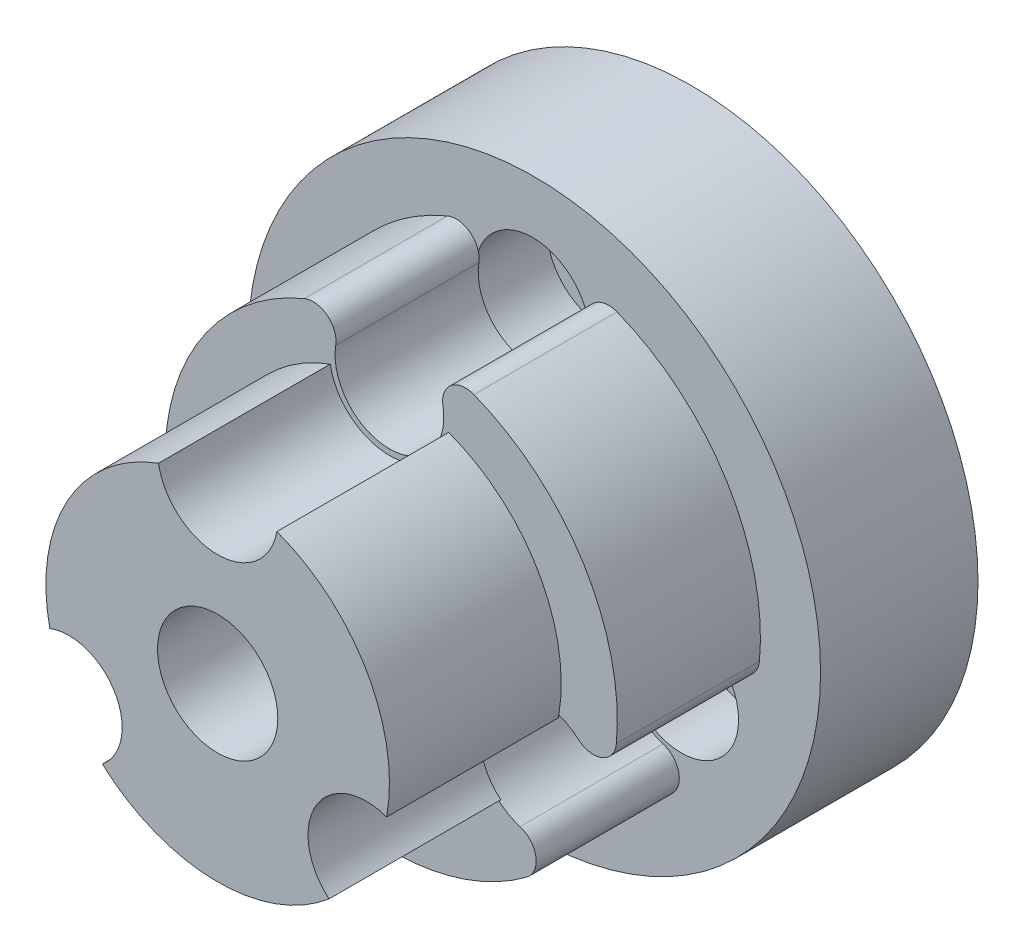
ISO-10303-21;
HEADER;
FILE_DESCRIPTION(('STEP AP214'),'2;1');
FILE_NAME('part.step','',(''),(''),'','','');
FILE_SCHEMA(('AUTOMOTIVE_DESIGN { 1 0 10303 214 1 1 1 1 }'));
ENDSEC;
DATA;
#1=APPLICATION_CONTEXT('core data for automotive mechanical design processes');
#2=APPLICATION_PROTOCOL_DEFINITION('international standard','automotive_design',2000,#1);
#3=PRODUCT_CONTEXT('',#1,'mechanical');
#4=PRODUCT('Part','Part','',(#3));
#5=PRODUCT_RELATED_PRODUCT_CATEGORY('part','',(#4));
#6=PRODUCT_DEFINITION_FORMATION('','',#4);
#7=PRODUCT_DEFINITION_CONTEXT('part definition',#1,'design');
#8=PRODUCT_DEFINITION('design','',#6,#7);
#9=PRODUCT_DEFINITION_SHAPE('','',#8);
#10=(LENGTH_UNIT() NAMED_UNIT(*) SI_UNIT(.MILLI.,.METRE.));
#11=(NAMED_UNIT(*) PLANE_ANGLE_UNIT() SI_UNIT($,.RADIAN.));
#12=(NAMED_UNIT(*) SI_UNIT($,.STERADIAN.) SOLID_ANGLE_UNIT());
#13=UNCERTAINTY_MEASURE_WITH_UNIT(LENGTH_MEASURE(1.E-05),#10,'distance_accuracy_value','');
#14=(GEOMETRIC_REPRESENTATION_CONTEXT(3) GLOBAL_UNCERTAINTY_ASSIGNED_CONTEXT((#13)) GLOBAL_UNIT_ASSIGNED_CONTEXT((#10,
#11,#12)) REPRESENTATION_CONTEXT('',''));
#15=CARTESIAN_POINT('',(0.,0.,0.));
#16=DIRECTION('',(0.,0.,1.));
#17=DIRECTION('',(1.,0.,0.));
#18=AXIS2_PLACEMENT_3D('',#15,#16,#17);
#19=CARTESIAN_POINT('',(-2.62756297658903,-1.43343334970842,-85.691169136308));
#20=DIRECTION('',(0.,0.,1.));
#21=DIRECTION('',(1.,0.,0.));
#22=AXIS2_PLACEMENT_3D('',#19,#20,#21);
#23=PLANE('',#22);
#24=CARTESIAN_POINT('',(-0.0589735304714241,0.133133300583156,-85.691169136308));
#25=DIRECTION('',(0.,0.,1.));
#26=DIRECTION('',(1.,0.,0.));
#27=AXIS2_PLACEMENT_3D('',#24,#25,#26);
#28=CIRCLE('',#27,6.);
#29=CARTESIAN_POINT('',(-2.12632985052675,5.76572043669808,-85.691169136308));
#30=VERTEX_POINT('',#29);
#31=CARTESIAN_POINT('',(-5.94622995595187,-1.02454186138551,-85.691169136308));
#32=VERTEX_POINT('',#31);
#33=EDGE_CURVE('E55',#30,#32,#28,.T.);
#34=ORIENTED_EDGE('',*,*,#33,.F.);
#35=CARTESIAN_POINT('',(-0.0589735304714241,6.13313330058316,-85.691169136308));
#36=DIRECTION('',(0.,0.,-1.));
#37=DIRECTION('',(1.,0.,0.));
#38=AXIS2_PLACEMENT_3D('',#35,#36,#37);
#39=CIRCLE('',#38,2.09975102491246);
#40=CARTESIAN_POINT('',(2.0083827895839,5.76572043669808,-85.691169136308));
#41=VERTEX_POINT('',#40);
#42=EDGE_CURVE('E59',#41,#30,#39,.T.);
#43=ORIENTED_EDGE('',*,*,#42,.F.);
#44=CARTESIAN_POINT('',(-0.0589735304714241,0.133133300583156,-85.691169136308));
#45=DIRECTION('',(0.,0.,1.));
#46=DIRECTION('',(1.,0.,0.));
#47=AXIS2_PLACEMENT_3D('',#44,#45,#46);
#48=CIRCLE('',#47,6.);
#49=CARTESIAN_POINT('',(5.85967243142608,-0.851564611324014,-85.691169136308));
#50=VERTEX_POINT('',#49);
#51=EDGE_CURVE('E11',#50,#41,#48,.T.);
#52=ORIENTED_EDGE('',*,*,#51,.F.);
#53=CARTESIAN_POINT('',(5.13717889223521,-2.86686669941684,-85.691169136308));
#54=DIRECTION('',(0.,0.,-1.));
#55=DIRECTION('',(1.,0.,0.));
#56=AXIS2_PLACEMENT_3D('',#53,#54,#55);
#57=CIRCLE('',#56,2.14089687291188);
#58=CARTESIAN_POINT('',(6.54432672808659,-1.25336913558149,-85.691169136308));
#59=VERTEX_POINT('',#58);
#60=EDGE_CURVE('E240',#50,#59,#57,.T.);
#61=ORIENTED_EDGE('',*,*,#60,.T.);
#62=CARTESIAN_POINT('',(7.07014293293255,-0.650445161334821,-85.691169136308));
#63=DIRECTION('',(0.,0.,1.));
#64=DIRECTION('',(1.,0.,0.));
#65=AXIS2_PLACEMENT_3D('',#62,#63,#64);
#66=CIRCLE('',#65,0.8);
#67=CARTESIAN_POINT('',(7.86677875636157,-0.723734756978181,-85.691169136308));
#68=VERTEX_POINT('',#67);
#69=EDGE_CURVE('E327',#59,#68,#66,.T.);
#70=ORIENTED_EDGE('',*,*,#69,.T.);
#71=CARTESIAN_POINT('',(0.,0.,-85.691169136308));
#72=DIRECTION('',(0.,0.,1.));
#73=DIRECTION('',(1.,0.,0.));
#74=AXIS2_PLACEMENT_3D('',#71,#72,#73);
#75=CIRCLE('',#74,7.9);
#76=CARTESIAN_POINT('',(2.89142422364797,7.35184779214734,-85.691169136308));
#77=VERTEX_POINT('',#76);
#78=EDGE_CURVE('E243',#68,#77,#75,.T.);
#79=ORIENTED_EDGE('',*,*,#78,.T.);
#80=CARTESIAN_POINT('',(2.59862177062033,6.60735687648685,-85.691169136308));
#81=DIRECTION('',(0.,0.,1.));
#82=DIRECTION('',(1.,0.,0.));
#83=AXIS2_PLACEMENT_3D('',#80,#81,#82);
#84=CIRCLE('',#83,0.8);
#85=CARTESIAN_POINT('',(1.81106192058844,6.46682402403679,-85.691169136308));
#86=VERTEX_POINT('',#85);
#87=EDGE_CURVE('E333',#77,#86,#84,.T.);
#88=ORIENTED_EDGE('',*,*,#87,.T.);
#89=CARTESIAN_POINT('',(-0.0589735304714284,6.13313330058316,-85.691169136308));
#90=DIRECTION('',(0.,0.,-1.));
#91=DIRECTION('',(1.,0.,0.));
#92=AXIS2_PLACEMENT_3D('',#89,#90,#91);
#93=CIRCLE('',#92,1.89957418574261);
#94=CARTESIAN_POINT('',(-1.9350798652424,6.43080276117985,-85.691169136308));
#95=VERTEX_POINT('',#94);
#96=EDGE_CURVE('E247',#86,#95,#93,.T.);
#97=ORIENTED_EDGE('',*,*,#96,.T.);
#98=CARTESIAN_POINT('',(-2.72519644983372,6.55616536626508,-85.691169136308));
#99=DIRECTION('',(0.,0.,1.));
#100=DIRECTION('',(1.,0.,0.));
#101=AXIS2_PLACEMENT_3D('',#98,#99,#100);
#102=CIRCLE('',#101,0.8);
#103=CARTESIAN_POINT('',(-3.03226083854737,7.29488822443579,-85.691169136308));
#104=VERTEX_POINT('',#103);
#105=EDGE_CURVE('E331',#95,#104,#102,.T.);
#106=ORIENTED_EDGE('',*,*,#105,.T.);
#107=CARTESIAN_POINT('',(0.,0.,-85.691169136308));
#108=DIRECTION('',(0.,0.,1.));
#109=DIRECTION('',(1.,0.,0.));
#110=AXIS2_PLACEMENT_3D('',#107,#108,#109);
#111=CIRCLE('',#110,7.9);
#112=CARTESIAN_POINT('',(-7.85373274021811,-0.853745890312869,-85.691169136308));
#113=VERTEX_POINT('',#112);
#114=EDGE_CURVE('E229',#104,#113,#111,.T.);
#115=ORIENTED_EDGE('',*,*,#114,.T.);
#116=CARTESIAN_POINT('',(-7.05841803234792,-0.767290610281186,-85.691169136308));
#117=DIRECTION('',(0.,0.,1.));
#118=DIRECTION('',(1.,0.,0.));
#119=AXIS2_PLACEMENT_3D('',#116,#117,#118);
#120=CIRCLE('',#119,0.8);
#121=CARTESIAN_POINT('',(-6.5371760947082,-1.37417350050432,-85.691169136308));
#122=VERTEX_POINT('',#121);
#123=EDGE_CURVE('E335',#113,#122,#120,.T.);
#124=ORIENTED_EDGE('',*,*,#123,.T.);
#125=CARTESIAN_POINT('',(-5.25512595317806,-2.86686669941684,-85.691169136308));
#126=DIRECTION('',(0.,0.,-1.));
#127=DIRECTION('',(1.,0.,0.));
#128=AXIS2_PLACEMENT_3D('',#125,#126,#127);
#129=CIRCLE('',#128,1.96768532836863);
#130=EDGE_CURVE('E234',#122,#32,#129,.T.);
#131=ORIENTED_EDGE('',*,*,#130,.T.);
#132=EDGE_LOOP('',(#34,#43,#52,#61,#70,#79,#88,#97,#106,#115,#124,#131));
#133=FACE_BOUND('',#132,.T.);
#134=ADVANCED_FACE('F37',(#133),#23,.T.);
#135=CARTESIAN_POINT('',(0.,0.,-85.691169136308));
#136=DIRECTION('',(0.,0.,1.));
#137=DIRECTION('',(1.,0.,0.));
#138=AXIS2_PLACEMENT_3D('',#135,#136,#137);
#139=CIRCLE('',#138,2.1);
#140=CARTESIAN_POINT('',(1.8894152834878,0.91657508504363,-85.691169136308));
#141=VERTEX_POINT('',#140);
#142=CARTESIAN_POINT('',(-1.94838881395916,-0.783441784460611,-85.691169136308));
#143=VERTEX_POINT('',#142);
#144=EDGE_CURVE('E221',#141,#143,#139,.T.);
#145=ORIENTED_EDGE('',*,*,#144,.F.);
#146=CARTESIAN_POINT('',(-0.0589735304714241,0.133133300583156,-85.691169136308));
#147=DIRECTION('',(0.,0.,1.));
#148=DIRECTION('',(1.,0.,0.));
#149=AXIS2_PLACEMENT_3D('',#146,#147,#148);
#150=CIRCLE('',#149,2.10000000000001);
#151=EDGE_CURVE('E401',#141,#143,#150,.T.);
#152=ORIENTED_EDGE('',*,*,#151,.T.);
#153=EDGE_LOOP('',(#145,#152));
#154=FACE_BOUND('',#153,.T.);
#155=ADVANCED_FACE('F425',(#154),#23,.T.);
#156=CARTESIAN_POINT('',(0.,0.,-93.191169136308));
#157=DIRECTION('',(0.,0.,1.));
#158=DIRECTION('',(1.,0.,0.));
#159=AXIS2_PLACEMENT_3D('',#156,#157,#158);
#160=PLANE('',#159);
#161=CARTESIAN_POINT('',(-5.25512595317806,-2.86686669941684,-93.191169136308));
#162=DIRECTION('',(0.,0.,1.));
#163=DIRECTION('',(1.,0.,0.));
#164=AXIS2_PLACEMENT_3D('',#161,#162,#163);
#165=CIRCLE('',#164,1.20000000000005);
#166=CARTESIAN_POINT('',(-4.05512595317801,-2.86686669941684,-93.191169136308));
#167=VERTEX_POINT('',#166);
#168=EDGE_CURVE('E290',#167,#167,#165,.T.);
#169=ORIENTED_EDGE('',*,*,#168,.F.);
#170=EDGE_LOOP('',(#169));
#171=FACE_BOUND('',#170,.T.);
#172=CARTESIAN_POINT('',(-5.25512595317806,-2.86686669941684,-93.191169136308));
#173=DIRECTION('',(0.,0.,1.));
#174=DIRECTION('',(1.,0.,0.));
#175=AXIS2_PLACEMENT_3D('',#172,#173,#174);
#176=CIRCLE('',#175,2.);
#177=CARTESIAN_POINT('',(-3.25512595317806,-2.86686669941684,-93.191169136308));
#178=VERTEX_POINT('',#177);
#179=EDGE_CURVE('E277',#178,#178,#176,.T.);
#180=ORIENTED_EDGE('',*,*,#179,.T.);
#181=EDGE_LOOP('',(#180));
#182=FACE_BOUND('',#181,.T.);
#183=ADVANCED_FACE('F431',(#171,#182),#160,.T.);
#184=CARTESIAN_POINT('',(-0.0589735304714284,6.13313330058316,-93.191169136308));
#185=DIRECTION('',(0.,0.,1.));
#186=DIRECTION('',(1.,0.,0.));
#187=AXIS2_PLACEMENT_3D('',#184,#185,#186);
#188=CIRCLE('',#187,1.2);
#189=CARTESIAN_POINT('',(1.14102646952857,6.13313330058316,-93.191169136308));
#190=VERTEX_POINT('',#189);
#191=EDGE_CURVE('E302',#190,#190,#188,.T.);
#192=ORIENTED_EDGE('',*,*,#191,.F.);
#193=EDGE_LOOP('',(#192));
#194=FACE_BOUND('',#193,.T.);
#195=CARTESIAN_POINT('',(-0.0589735304714284,6.13313330058316,-93.191169136308));
#196=DIRECTION('',(0.,0.,1.));
#197=DIRECTION('',(1.,0.,0.));
#198=AXIS2_PLACEMENT_3D('',#195,#196,#197);
#199=CIRCLE('',#198,2.);
#200=CARTESIAN_POINT('',(1.94102646952857,6.13313330058316,-93.191169136308));
#201=VERTEX_POINT('',#200);
#202=EDGE_CURVE('E272',#201,#201,#199,.T.);
#203=ORIENTED_EDGE('',*,*,#202,.T.);
#204=EDGE_LOOP('',(#203));
#205=FACE_BOUND('',#204,.T.);
#206=ADVANCED_FACE('F558',(#194,#205),#160,.T.);
#207=CARTESIAN_POINT('',(5.13717889223521,-2.86686669941684,-93.191169136308));
#208=DIRECTION('',(0.,0.,1.));
#209=DIRECTION('',(1.,0.,0.));
#210=AXIS2_PLACEMENT_3D('',#207,#208,#209);
#211=CIRCLE('',#210,1.20000000000005);
#212=CARTESIAN_POINT('',(6.33717889223526,-2.86686669941684,-93.191169136308));
#213=VERTEX_POINT('',#212);
#214=EDGE_CURVE('E296',#213,#213,#211,.T.);
#215=ORIENTED_EDGE('',*,*,#214,.F.);
#216=EDGE_LOOP('',(#215));
#217=FACE_BOUND('',#216,.T.);
#218=CARTESIAN_POINT('',(5.13717889223521,-2.86686669941684,-93.191169136308));
#219=DIRECTION('',(0.,0.,1.));
#220=DIRECTION('',(1.,0.,0.));
#221=AXIS2_PLACEMENT_3D('',#218,#219,#220);
#222=CIRCLE('',#221,2.);
#223=CARTESIAN_POINT('',(7.13717889223521,-2.86686669941684,-93.191169136308));
#224=VERTEX_POINT('',#223);
#225=EDGE_CURVE('E250',#224,#224,#222,.T.);
#226=ORIENTED_EDGE('',*,*,#225,.T.);
#227=EDGE_LOOP('',(#226));
#228=FACE_BOUND('',#227,.T.);
#229=ADVANCED_FACE('F554',(#217,#228),#160,.T.);
#230=CARTESIAN_POINT('',(0.,0.,-96.191169136308));
#231=DIRECTION('',(0.,0.,1.));
#232=DIRECTION('',(1.,0.,0.));
#233=AXIS2_PLACEMENT_3D('',#230,#231,#232);
#234=PLANE('',#233);
#235=CARTESIAN_POINT('',(0.,0.,-96.191169136308));
#236=DIRECTION('',(0.,0.,1.));
#237=DIRECTION('',(1.,0.,0.));
#238=AXIS2_PLACEMENT_3D('',#235,#236,#237);
#239=CIRCLE('',#238,10.);
#240=CARTESIAN_POINT('',(10.,0.,-96.191169136308));
#241=VERTEX_POINT('',#240);
#242=EDGE_CURVE('E261',#241,#241,#239,.T.);
#243=ORIENTED_EDGE('',*,*,#242,.F.);
#244=EDGE_LOOP('',(#243));
#245=FACE_BOUND('',#244,.T.);
#246=CARTESIAN_POINT('',(0.,0.,-96.191169136308));
#247=DIRECTION('',(0.,0.,1.));
#248=DIRECTION('',(1.,0.,0.));
#249=AXIS2_PLACEMENT_3D('',#246,#247,#248);
#250=CIRCLE('',#249,2.1);
#251=CARTESIAN_POINT('',(2.10000000000001,0.,-96.191169136308));
#252=VERTEX_POINT('',#251);
#253=EDGE_CURVE('E305',#252,#252,#250,.T.);
#254=ORIENTED_EDGE('',*,*,#253,.T.);
#255=EDGE_LOOP('',(#254));
#256=FACE_BOUND('',#255,.T.);
#257=CARTESIAN_POINT('',(-0.0589735304714284,6.13313330058316,-96.191169136308));
#258=DIRECTION('',(0.,0.,1.));
#259=DIRECTION('',(1.,0.,0.));
#260=AXIS2_PLACEMENT_3D('',#257,#258,#259);
#261=CIRCLE('',#260,1.2);
#262=CARTESIAN_POINT('',(1.14102646952857,6.13313330058316,-96.191169136308));
#263=VERTEX_POINT('',#262);
#264=EDGE_CURVE('E299',#263,#263,#261,.T.);
#265=ORIENTED_EDGE('',*,*,#264,.T.);
#266=EDGE_LOOP('',(#265));
#267=FACE_BOUND('',#266,.T.);
#268=CARTESIAN_POINT('',(5.13717889223521,-2.86686669941684,-96.191169136308));
#269=DIRECTION('',(0.,0.,1.));
#270=DIRECTION('',(1.,0.,0.));
#271=AXIS2_PLACEMENT_3D('',#268,#269,#270);
#272=CIRCLE('',#271,1.20000000000005);
#273=CARTESIAN_POINT('',(6.33717889223526,-2.86686669941684,-96.191169136308));
#274=VERTEX_POINT('',#273);
#275=EDGE_CURVE('E293',#274,#274,#272,.T.);
#276=ORIENTED_EDGE('',*,*,#275,.T.);
#277=EDGE_LOOP('',(#276));
#278=FACE_BOUND('',#277,.T.);
#279=CARTESIAN_POINT('',(-5.25512595317806,-2.86686669941684,-96.191169136308));
#280=DIRECTION('',(0.,0.,1.));
#281=DIRECTION('',(1.,0.,0.));
#282=AXIS2_PLACEMENT_3D('',#279,#280,#281);
#283=CIRCLE('',#282,1.20000000000005);
#284=CARTESIAN_POINT('',(-4.05512595317801,-2.86686669941684,-96.191169136308));
#285=VERTEX_POINT('',#284);
#286=EDGE_CURVE('E289',#285,#285,#283,.T.);
#287=ORIENTED_EDGE('',*,*,#286,.T.);
#288=EDGE_LOOP('',(#287));
#289=FACE_BOUND('',#288,.T.);
#290=ADVANCED_FACE('F550',(#245,#256,#267,#278,#289),#234,.F.);
#291=CARTESIAN_POINT('',(0.,0.,-93.191169136308));
#292=DIRECTION('',(0.,0.,-1.));
#293=DIRECTION('',(-1.,0.,0.));
#294=AXIS2_PLACEMENT_3D('',#291,#292,#293);
#295=CYLINDRICAL_SURFACE('',#294,10.);
#296=ORIENTED_EDGE('',*,*,#242,.T.);
#297=EDGE_LOOP('',(#296));
#298=FACE_BOUND('',#297,.T.);
#299=CARTESIAN_POINT('',(0.,0.,-90.691169136308));
#300=DIRECTION('',(0.,0.,1.));
#301=DIRECTION('',(1.,0.,0.));
#302=AXIS2_PLACEMENT_3D('',#299,#300,#301);
#303=CIRCLE('',#302,10.);
#304=CARTESIAN_POINT('',(10.,0.,-90.691169136308));
#305=VERTEX_POINT('',#304);
#306=EDGE_CURVE('E283',#305,#305,#303,.T.);
#307=ORIENTED_EDGE('',*,*,#306,.F.);
#308=EDGE_LOOP('',(#307));
#309=FACE_BOUND('',#308,.T.);
#310=ADVANCED_FACE('F546',(#298,#309),#295,.T.);
#311=CARTESIAN_POINT('',(0.,0.,-93.191169136308));
#312=DIRECTION('',(0.,0.,-1.));
#313=DIRECTION('',(-1.,0.,0.));
#314=AXIS2_PLACEMENT_3D('',#311,#312,#313);
#315=CYLINDRICAL_SURFACE('',#314,2.1);
#316=ORIENTED_EDGE('',*,*,#253,.F.);
#317=EDGE_LOOP('',(#316));
#318=FACE_BOUND('',#317,.T.);
#319=ORIENTED_EDGE('',*,*,#144,.T.);
#320=EDGE_CURVE('E218',#143,#141,#139,.T.);
#321=ORIENTED_EDGE('',*,*,#320,.T.);
#322=EDGE_LOOP('',(#319,#321));
#323=FACE_BOUND('',#322,.T.);
#324=ADVANCED_FACE('F549',(#318,#323),#315,.F.);
#325=CARTESIAN_POINT('',(-0.0589735304714284,6.13313330058316,-93.191169136308));
#326=DIRECTION('',(0.,0.,-1.));
#327=DIRECTION('',(-1.,0.,0.));
#328=AXIS2_PLACEMENT_3D('',#325,#326,#327);
#329=CYLINDRICAL_SURFACE('',#328,1.2);
#330=ORIENTED_EDGE('',*,*,#191,.T.);
#331=EDGE_LOOP('',(#330));
#332=FACE_BOUND('',#331,.T.);
#333=ORIENTED_EDGE('',*,*,#264,.F.);
#334=EDGE_LOOP('',(#333));
#335=FACE_BOUND('',#334,.T.);
#336=ADVANCED_FACE('F562',(#332,#335),#329,.F.);
#337=CARTESIAN_POINT('',(5.13717889223521,-2.86686669941684,-93.191169136308));
#338=DIRECTION('',(0.,0.,-1.));
#339=DIRECTION('',(-1.,0.,0.));
#340=AXIS2_PLACEMENT_3D('',#337,#338,#339);
#341=CYLINDRICAL_SURFACE('',#340,1.20000000000005);
#342=ORIENTED_EDGE('',*,*,#214,.T.);
#343=EDGE_LOOP('',(#342));
#344=FACE_BOUND('',#343,.T.);
#345=ORIENTED_EDGE('',*,*,#275,.F.);
#346=EDGE_LOOP('',(#345));
#347=FACE_BOUND('',#346,.T.);
#348=ADVANCED_FACE('F566',(#344,#347),#341,.F.);
#349=CARTESIAN_POINT('',(-5.25512595317806,-2.86686669941684,-93.191169136308));
#350=DIRECTION('',(0.,0.,-1.));
#351=DIRECTION('',(-1.,0.,0.));
#352=AXIS2_PLACEMENT_3D('',#349,#350,#351);
#353=CYLINDRICAL_SURFACE('',#352,1.20000000000005);
#354=ORIENTED_EDGE('',*,*,#168,.T.);
#355=EDGE_LOOP('',(#354));
#356=FACE_BOUND('',#355,.T.);
#357=ORIENTED_EDGE('',*,*,#286,.F.);
#358=EDGE_LOOP('',(#357));
#359=FACE_BOUND('',#358,.T.);
#360=ADVANCED_FACE('F570',(#356,#359),#353,.F.);
#361=CARTESIAN_POINT('',(0.,0.,-90.691169136308));
#362=DIRECTION('',(0.,0.,1.));
#363=DIRECTION('',(1.,0.,0.));
#364=AXIS2_PLACEMENT_3D('',#361,#362,#363);
#365=PLANE('',#364);
#366=CARTESIAN_POINT('',(0.,0.,-90.691169136308));
#367=DIRECTION('',(0.,0.,1.));
#368=DIRECTION('',(1.,0.,0.));
#369=AXIS2_PLACEMENT_3D('',#366,#367,#368);
#370=CIRCLE('',#369,7.9);
#371=CARTESIAN_POINT('',(-3.03226083854737,7.29488822443579,-90.691169136308));
#372=VERTEX_POINT('',#371);
#373=CARTESIAN_POINT('',(-7.85373274021811,-0.853745890312869,-90.691169136308));
#374=VERTEX_POINT('',#373);
#375=EDGE_CURVE('E251',#372,#374,#370,.T.);
#376=ORIENTED_EDGE('',*,*,#375,.F.);
#377=CARTESIAN_POINT('',(-2.72519644983372,6.55616536626508,-90.691169136308));
#378=DIRECTION('',(0.,0.,1.));
#379=DIRECTION('',(1.,0.,0.));
#380=AXIS2_PLACEMENT_3D('',#377,#378,#379);
#381=CIRCLE('',#380,0.8);
#382=CARTESIAN_POINT('',(-1.9545576497098,6.7709113551533,-90.691169136308));
#383=VERTEX_POINT('',#382);
#384=EDGE_CURVE('E372',#372,#383,#381,.F.);
#385=ORIENTED_EDGE('',*,*,#384,.T.);
#386=CARTESIAN_POINT('',(-0.0589735304714284,6.13313330058316,-90.691169136308));
#387=DIRECTION('',(0.,0.,1.));
#388=DIRECTION('',(1.,0.,0.));
#389=AXIS2_PLACEMENT_3D('',#386,#387,#388);
#390=CIRCLE('',#389,2.);
#391=CARTESIAN_POINT('',(1.82399603696545,6.80724427668915,-90.691169136308));
#392=VERTEX_POINT('',#391);
#393=EDGE_CURVE('E275',#392,#383,#390,.T.);
#394=ORIENTED_EDGE('',*,*,#393,.F.);
#395=CARTESIAN_POINT('',(2.59862177062033,6.60735687648685,-90.691169136308));
#396=DIRECTION('',(0.,0.,1.));
#397=DIRECTION('',(1.,0.,0.));
#398=AXIS2_PLACEMENT_3D('',#395,#396,#397);
#399=CIRCLE('',#398,0.8);
#400=CARTESIAN_POINT('',(2.89142422364797,7.35184779214734,-90.691169136308));
#401=VERTEX_POINT('',#400);
#402=EDGE_CURVE('E370',#392,#401,#399,.F.);
#403=ORIENTED_EDGE('',*,*,#402,.T.);
#404=CARTESIAN_POINT('',(0.,0.,-90.691169136308));
#405=DIRECTION('',(0.,0.,1.));
#406=DIRECTION('',(1.,0.,0.));
#407=AXIS2_PLACEMENT_3D('',#404,#405,#406);
#408=CIRCLE('',#407,7.9);
#409=CARTESIAN_POINT('',(7.86677875636157,-0.723734756978181,-90.691169136308));
#410=VERTEX_POINT('',#409);
#411=EDGE_CURVE('E264',#410,#401,#408,.T.);
#412=ORIENTED_EDGE('',*,*,#411,.F.);
#413=CARTESIAN_POINT('',(7.07014293293255,-0.650445161334821,-90.691169136308));
#414=DIRECTION('',(0.,0.,1.));
#415=DIRECTION('',(1.,0.,0.));
#416=AXIS2_PLACEMENT_3D('',#413,#414,#415);
#417=CIRCLE('',#416,0.8);
#418=CARTESIAN_POINT('',(6.54432672808659,-1.25336913558149,-90.691169136308));
#419=VERTEX_POINT('',#418);
#420=EDGE_CURVE('E41',#410,#419,#417,.F.);
#421=ORIENTED_EDGE('',*,*,#420,.T.);
#422=CARTESIAN_POINT('',(5.13717889223521,-2.86686669941684,-90.691169136308));
#423=DIRECTION('',(0.,0.,-1.));
#424=DIRECTION('',(1.,0.,0.));
#425=AXIS2_PLACEMENT_3D('',#422,#423,#424);
#426=CIRCLE('',#425,2.14089687291188);
#427=CARTESIAN_POINT('',(4.50279663175537,-4.91161572265475,-90.691169136308));
#428=VERTEX_POINT('',#427);
#429=EDGE_CURVE('E258',#428,#419,#426,.T.);
#430=ORIENTED_EDGE('',*,*,#429,.F.);
#431=CARTESIAN_POINT('',(4.26574373359611,-5.67568765871463,-90.691169136308));
#432=DIRECTION('',(0.,0.,1.));
#433=DIRECTION('',(1.,0.,0.));
#434=AXIS2_PLACEMENT_3D('',#431,#432,#433);
#435=CIRCLE('',#434,0.8);
#436=CARTESIAN_POINT('',(4.74639091484637,-6.31520176110501,-90.691169136308));
#437=VERTEX_POINT('',#436);
#438=EDGE_CURVE('E374',#428,#437,#435,.F.);
#439=ORIENTED_EDGE('',*,*,#438,.T.);
#440=CARTESIAN_POINT('',(0.,0.,-90.691169136308));
#441=DIRECTION('',(0.,0.,1.));
#442=DIRECTION('',(1.,0.,0.));
#443=AXIS2_PLACEMENT_3D('',#440,#441,#442);
#444=CIRCLE('',#443,7.9);
#445=CARTESIAN_POINT('',(-4.96903761078447,-6.14155234632168,-90.691169136308));
#446=VERTEX_POINT('',#445);
#447=EDGE_CURVE('E255',#446,#437,#444,.T.);
#448=ORIENTED_EDGE('',*,*,#447,.F.);
#449=CARTESIAN_POINT('',(-4.46584392867972,-5.51962299479543,-90.691169136308));
#450=DIRECTION('',(0.,0.,1.));
#451=DIRECTION('',(1.,0.,0.));
#452=AXIS2_PLACEMENT_3D('',#449,#450,#451);
#453=CIRCLE('',#452,0.8);
#454=CARTESIAN_POINT('',(-4.87055682376635,-4.82954512053007,-90.691169136308));
#455=VERTEX_POINT('',#454);
#456=EDGE_CURVE('E365',#446,#455,#453,.F.);
#457=ORIENTED_EDGE('',*,*,#456,.T.);
#458=CARTESIAN_POINT('',(-5.25512595317806,-2.86686669941684,-90.691169136308));
#459=DIRECTION('',(0.,0.,1.));
#460=DIRECTION('',(1.,0.,0.));
#461=AXIS2_PLACEMENT_3D('',#458,#459,#460);
#462=CIRCLE('',#461,2.);
#463=CARTESIAN_POINT('',(-6.69724630200594,-1.48112180965663,-90.691169136308));
#464=VERTEX_POINT('',#463);
#465=EDGE_CURVE('E281',#464,#455,#462,.T.);
#466=ORIENTED_EDGE('',*,*,#465,.F.);
#467=CARTESIAN_POINT('',(-7.05841803234792,-0.767290610281186,-90.691169136308));
#468=DIRECTION('',(0.,0.,1.));
#469=DIRECTION('',(1.,0.,0.));
#470=AXIS2_PLACEMENT_3D('',#467,#468,#469);
#471=CIRCLE('',#470,0.8);
#472=EDGE_CURVE('E368',#464,#374,#471,.F.);
#473=ORIENTED_EDGE('',*,*,#472,.T.);
#474=EDGE_LOOP('',(#376,#385,#394,#403,#412,#421,#430,#439,#448,#457,#466,#473));
#475=FACE_BOUND('',#474,.T.);
#476=CARTESIAN_POINT('',(5.13717889223521,-2.86686669941684,-90.691169136308));
#477=DIRECTION('',(0.,0.,1.));
#478=DIRECTION('',(1.,0.,0.));
#479=AXIS2_PLACEMENT_3D('',#476,#477,#478);
#480=CIRCLE('',#479,2.);
#481=CARTESIAN_POINT('',(7.13717889223521,-2.86686669941684,-90.691169136308));
#482=VERTEX_POINT('',#481);
#483=EDGE_CURVE('E269',#482,#482,#480,.T.);
#484=ORIENTED_EDGE('',*,*,#483,.F.);
#485=EDGE_LOOP('',(#484));
#486=FACE_BOUND('',#485,.T.);
#487=ORIENTED_EDGE('',*,*,#306,.T.);
#488=EDGE_LOOP('',(#487));
#489=FACE_BOUND('',#488,.T.);
#490=ADVANCED_FACE('F493',(#475,#486,#489),#365,.T.);
#491=CARTESIAN_POINT('',(-5.25512595317806,-2.86686669941684,-90.691169136308));
#492=DIRECTION('',(0.,0.,-1.));
#493=DIRECTION('',(-1.,0.,0.));
#494=AXIS2_PLACEMENT_3D('',#491,#492,#493);
#495=CYLINDRICAL_SURFACE('',#494,2.);
#496=ORIENTED_EDGE('',*,*,#465,.T.);
#497=EDGE_CURVE('E284',#455,#464,#462,.T.);
#498=ORIENTED_EDGE('',*,*,#497,.T.);
#499=EDGE_LOOP('',(#496,#498));
#500=FACE_BOUND('',#499,.T.);
#501=ORIENTED_EDGE('',*,*,#179,.F.);
#502=EDGE_LOOP('',(#501));
#503=FACE_BOUND('',#502,.T.);
#504=ADVANCED_FACE('F577',(#500,#503),#495,.F.);
#505=CARTESIAN_POINT('',(-0.0589735304714284,6.13313330058316,-90.691169136308));
#506=DIRECTION('',(0.,0.,-1.));
#507=DIRECTION('',(-1.,0.,0.));
#508=AXIS2_PLACEMENT_3D('',#505,#506,#507);
#509=CYLINDRICAL_SURFACE('',#508,2.);
#510=ORIENTED_EDGE('',*,*,#393,.T.);
#511=EDGE_CURVE('E278',#383,#392,#390,.T.);
#512=ORIENTED_EDGE('',*,*,#511,.T.);
#513=EDGE_LOOP('',(#510,#512));
#514=FACE_BOUND('',#513,.T.);
#515=ORIENTED_EDGE('',*,*,#202,.F.);
#516=EDGE_LOOP('',(#515));
#517=FACE_BOUND('',#516,.T.);
#518=ADVANCED_FACE('F580',(#514,#517),#509,.F.);
#519=CARTESIAN_POINT('',(5.13717889223521,-2.86686669941684,-90.691169136308));
#520=DIRECTION('',(0.,0.,-1.));
#521=DIRECTION('',(-1.,0.,0.));
#522=AXIS2_PLACEMENT_3D('',#519,#520,#521);
#523=CYLINDRICAL_SURFACE('',#522,2.);
#524=ORIENTED_EDGE('',*,*,#483,.T.);
#525=EDGE_LOOP('',(#524));
#526=FACE_BOUND('',#525,.T.);
#527=ORIENTED_EDGE('',*,*,#225,.F.);
#528=EDGE_LOOP('',(#527));
#529=FACE_BOUND('',#528,.T.);
#530=ADVANCED_FACE('F445',(#526,#529),#523,.F.);
#531=CARTESIAN_POINT('',(-2.62756297658903,-1.43343334970842,-90.691169136308));
#532=DIRECTION('',(0.,0.,1.));
#533=DIRECTION('',(1.,0.,0.));
#534=AXIS2_PLACEMENT_3D('',#531,#532,#533);
#535=PLANE('',#534);
#536=ORIENTED_EDGE('',*,*,#497,.F.);
#537=CARTESIAN_POINT('',(-4.46584392867972,-5.51962299479543,-90.691169136308));
#538=DIRECTION('',(0.,0.,1.));
#539=DIRECTION('',(1.,0.,0.));
#540=AXIS2_PLACEMENT_3D('',#537,#538,#539);
#541=CIRCLE('',#540,0.8);
#542=CARTESIAN_POINT('',(-4.6939860563727,-4.75284325486243,-90.691169136308));
#543=VERTEX_POINT('',#542);
#544=EDGE_CURVE('E319',#455,#543,#541,.F.);
#545=ORIENTED_EDGE('',*,*,#544,.T.);
#546=CARTESIAN_POINT('',(-5.25512595317806,-2.86686669941684,-90.691169136308));
#547=DIRECTION('',(0.,0.,-1.));
#548=DIRECTION('',(1.,0.,0.));
#549=AXIS2_PLACEMENT_3D('',#546,#547,#548);
#550=CIRCLE('',#549,1.96768532836863);
#551=CARTESIAN_POINT('',(-6.5371760947082,-1.37417350050432,-90.691169136308));
#552=VERTEX_POINT('',#551);
#553=EDGE_CURVE('E228',#552,#543,#550,.T.);
#554=ORIENTED_EDGE('',*,*,#553,.F.);
#555=CARTESIAN_POINT('',(-7.05841803234792,-0.767290610281186,-90.691169136308));
#556=DIRECTION('',(0.,0.,1.));
#557=DIRECTION('',(1.,0.,0.));
#558=AXIS2_PLACEMENT_3D('',#555,#556,#557);
#559=CIRCLE('',#558,0.8);
#560=EDGE_CURVE('E316',#552,#464,#559,.F.);
#561=ORIENTED_EDGE('',*,*,#560,.T.);
#562=EDGE_LOOP('',(#536,#545,#554,#561));
#563=FACE_BOUND('',#562,.T.);
#564=ADVANCED_FACE('F437',(#563),#535,.F.);
#565=CARTESIAN_POINT('',(-0.0589735304714241,0.133133300583156,-85.691169136308));
#566=DIRECTION('',(0.,0.,1.));
#567=DIRECTION('',(1.,0.,0.));
#568=AXIS2_PLACEMENT_3D('',#565,#566,#567);
#569=CIRCLE('',#568,6.);
#570=CARTESIAN_POINT('',(-4.00517784280679,-4.38654274149174,-85.691169136308));
#571=VERTEX_POINT('',#570);
#572=CARTESIAN_POINT('',(3.75312285724243,-4.50021550247269,-85.691169136308));
#573=VERTEX_POINT('',#572);
#574=EDGE_CURVE('E46',#571,#573,#569,.T.);
#575=ORIENTED_EDGE('',*,*,#574,.F.);
#576=CARTESIAN_POINT('',(-4.6939860563727,-4.75284325486243,-85.691169136308));
#577=VERTEX_POINT('',#576);
#578=EDGE_CURVE('E232',#571,#577,#129,.T.);
#579=ORIENTED_EDGE('',*,*,#578,.T.);
#580=CARTESIAN_POINT('',(-4.46584392867972,-5.51962299479543,-85.691169136308));
#581=DIRECTION('',(0.,0.,1.));
#582=DIRECTION('',(1.,0.,0.));
#583=AXIS2_PLACEMENT_3D('',#580,#581,#582);
#584=CIRCLE('',#583,0.8);
#585=CARTESIAN_POINT('',(-4.96903761078447,-6.14155234632168,-85.691169136308));
#586=VERTEX_POINT('',#585);
#587=EDGE_CURVE('E337',#577,#586,#584,.T.);
#588=ORIENTED_EDGE('',*,*,#587,.T.);
#589=CARTESIAN_POINT('',(0.,0.,-85.691169136308));
#590=DIRECTION('',(0.,0.,1.));
#591=DIRECTION('',(1.,0.,0.));
#592=AXIS2_PLACEMENT_3D('',#589,#590,#591);
#593=CIRCLE('',#592,7.9);
#594=CARTESIAN_POINT('',(4.74639091484637,-6.31520176110501,-85.691169136308));
#595=VERTEX_POINT('',#594);
#596=EDGE_CURVE('E236',#586,#595,#593,.T.);
#597=ORIENTED_EDGE('',*,*,#596,.T.);
#598=CARTESIAN_POINT('',(4.26574373359611,-5.67568765871463,-85.691169136308));
#599=DIRECTION('',(0.,0.,1.));
#600=DIRECTION('',(1.,0.,0.));
#601=AXIS2_PLACEMENT_3D('',#598,#599,#600);
#602=CIRCLE('',#601,0.8);
#603=CARTESIAN_POINT('',(4.50279663175537,-4.91161572265475,-85.691169136308));
#604=VERTEX_POINT('',#603);
#605=EDGE_CURVE('E329',#595,#604,#602,.T.);
#606=ORIENTED_EDGE('',*,*,#605,.T.);
#607=EDGE_CURVE('E241',#604,#573,#57,.T.);
#608=ORIENTED_EDGE('',*,*,#607,.T.);
#609=EDGE_LOOP('',(#575,#579,#588,#597,#606,#608));
#610=FACE_BOUND('',#609,.T.);
#611=ADVANCED_FACE('F427',(#610),#23,.T.);
#612=CARTESIAN_POINT('',(-0.0589735304714284,6.13313330058316,-90.691169136308));
#613=DIRECTION('',(0.,0.,-1.));
#614=DIRECTION('',(1.,0.,0.));
#615=AXIS2_PLACEMENT_3D('',#612,#613,#614);
#616=CIRCLE('',#615,1.89957418574261);
#617=CARTESIAN_POINT('',(1.81106192058844,6.46682402403679,-90.691169136308));
#618=VERTEX_POINT('',#617);
#619=CARTESIAN_POINT('',(-1.9350798652424,6.43080276117985,-90.691169136308));
#620=VERTEX_POINT('',#619);
#621=EDGE_CURVE('E233',#618,#620,#616,.T.);
#622=ORIENTED_EDGE('',*,*,#621,.F.);
#623=CARTESIAN_POINT('',(2.59862177062033,6.60735687648685,-90.691169136308));
#624=DIRECTION('',(0.,0.,1.));
#625=DIRECTION('',(1.,0.,0.));
#626=AXIS2_PLACEMENT_3D('',#623,#624,#625);
#627=CIRCLE('',#626,0.8);
#628=EDGE_CURVE('E351',#618,#392,#627,.F.);
#629=ORIENTED_EDGE('',*,*,#628,.T.);
#630=ORIENTED_EDGE('',*,*,#511,.F.);
#631=CARTESIAN_POINT('',(-2.72519644983372,6.55616536626508,-90.691169136308));
#632=DIRECTION('',(0.,0.,1.));
#633=DIRECTION('',(1.,0.,0.));
#634=AXIS2_PLACEMENT_3D('',#631,#632,#633);
#635=CIRCLE('',#634,0.8);
#636=EDGE_CURVE('E349',#383,#620,#635,.F.);
#637=ORIENTED_EDGE('',*,*,#636,.T.);
#638=EDGE_LOOP('',(#622,#629,#630,#637));
#639=FACE_BOUND('',#638,.T.);
#640=ADVANCED_FACE('F436',(#639),#535,.F.);
#641=CARTESIAN_POINT('',(0.,0.,-85.691169136308));
#642=DIRECTION('',(0.,0.,-1.));
#643=DIRECTION('',(-1.,0.,0.));
#644=AXIS2_PLACEMENT_3D('',#641,#642,#643);
#645=CYLINDRICAL_SURFACE('',#644,7.9);
#646=ORIENTED_EDGE('',*,*,#375,.T.);
#647=DIRECTION('',(0.,0.,-1.));
#648=VECTOR('',#647,1.);
#649=CARTESIAN_POINT('',(-7.85373274021811,-0.853745890312869,-85.691169136308));
#650=LINE('',#649,#648);
#651=EDGE_CURVE('E342',#374,#113,#650,.F.);
#652=ORIENTED_EDGE('',*,*,#651,.T.);
#653=ORIENTED_EDGE('',*,*,#114,.F.);
#654=DIRECTION('',(0.,0.,-1.));
#655=VECTOR('',#654,1.);
#656=CARTESIAN_POINT('',(-3.03226083854737,7.29488822443579,-85.691169136308));
#657=LINE('',#656,#655);
#658=EDGE_CURVE('E339',#104,#372,#657,.T.);
#659=ORIENTED_EDGE('',*,*,#658,.T.);
#660=EDGE_LOOP('',(#646,#652,#653,#659));
#661=FACE_BOUND('',#660,.T.);
#662=ADVANCED_FACE('F443',(#661),#645,.T.);
#663=CARTESIAN_POINT('',(-5.25512595317806,-2.86686669941684,-85.691169136308));
#664=DIRECTION('',(0.,0.,-1.));
#665=DIRECTION('',(-1.,0.,0.));
#666=AXIS2_PLACEMENT_3D('',#663,#664,#665);
#667=CYLINDRICAL_SURFACE('',#666,1.96768532836863);
#668=ORIENTED_EDGE('',*,*,#553,.T.);
#669=DIRECTION('',(0.,0.,-1.));
#670=VECTOR('',#669,1.);
#671=CARTESIAN_POINT('',(-4.6939860563727,-4.75284325486243,-85.691169136308));
#672=LINE('',#671,#670);
#673=EDGE_CURVE('E324',#543,#577,#672,.F.);
#674=ORIENTED_EDGE('',*,*,#673,.T.);
#675=ORIENTED_EDGE('',*,*,#578,.F.);
#676=EDGE_CURVE('E237',#32,#571,#129,.T.);
#677=ORIENTED_EDGE('',*,*,#676,.F.);
#678=ORIENTED_EDGE('',*,*,#130,.F.);
#679=DIRECTION('',(0.,0.,-1.));
#680=VECTOR('',#679,1.);
#681=CARTESIAN_POINT('',(-6.5371760947082,-1.37417350050432,-85.691169136308));
#682=LINE('',#681,#680);
#683=EDGE_CURVE('E321',#122,#552,#682,.T.);
#684=ORIENTED_EDGE('',*,*,#683,.T.);
#685=EDGE_LOOP('',(#668,#674,#675,#677,#678,#684));
#686=FACE_BOUND('',#685,.T.);
#687=ADVANCED_FACE('F452',(#686),#667,.F.);
#688=CARTESIAN_POINT('',(0.,0.,-85.691169136308));
#689=DIRECTION('',(0.,0.,-1.));
#690=DIRECTION('',(-1.,0.,0.));
#691=AXIS2_PLACEMENT_3D('',#688,#689,#690);
#692=CYLINDRICAL_SURFACE('',#691,7.9);
#693=ORIENTED_EDGE('',*,*,#596,.F.);
#694=DIRECTION('',(0.,0.,-1.));
#695=VECTOR('',#694,1.);
#696=CARTESIAN_POINT('',(-4.96903761078447,-6.14155234632168,-85.691169136308));
#697=LINE('',#696,#695);
#698=EDGE_CURVE('E313',#586,#446,#697,.T.);
#699=ORIENTED_EDGE('',*,*,#698,.T.);
#700=ORIENTED_EDGE('',*,*,#447,.T.);
#701=DIRECTION('',(0.,0.,-1.));
#702=VECTOR('',#701,1.);
#703=CARTESIAN_POINT('',(4.74639091484637,-6.31520176110501,-85.691169136308));
#704=LINE('',#703,#702);
#705=EDGE_CURVE('E254',#437,#595,#704,.F.);
#706=ORIENTED_EDGE('',*,*,#705,.T.);
#707=EDGE_LOOP('',(#693,#699,#700,#706));
#708=FACE_BOUND('',#707,.T.);
#709=ADVANCED_FACE('F528',(#708),#692,.T.);
#710=CARTESIAN_POINT('',(5.13717889223521,-2.86686669941684,-85.691169136308));
#711=DIRECTION('',(0.,0.,-1.));
#712=DIRECTION('',(-1.,0.,0.));
#713=AXIS2_PLACEMENT_3D('',#710,#711,#712);
#714=CYLINDRICAL_SURFACE('',#713,2.14089687291188);
#715=ORIENTED_EDGE('',*,*,#607,.F.);
#716=DIRECTION('',(0.,0.,-1.));
#717=VECTOR('',#716,1.);
#718=CARTESIAN_POINT('',(4.50279663175537,-4.91161572265475,-85.691169136308));
#719=LINE('',#718,#717);
#720=EDGE_CURVE('E362',#604,#428,#719,.T.);
#721=ORIENTED_EDGE('',*,*,#720,.T.);
#722=ORIENTED_EDGE('',*,*,#429,.T.);
#723=DIRECTION('',(0.,0.,-1.));
#724=VECTOR('',#723,1.);
#725=CARTESIAN_POINT('',(6.54432672808659,-1.25336913558149,-85.691169136308));
#726=LINE('',#725,#724);
#727=EDGE_CURVE('E359',#419,#59,#726,.F.);
#728=ORIENTED_EDGE('',*,*,#727,.T.);
#729=ORIENTED_EDGE('',*,*,#60,.F.);
#730=EDGE_CURVE('E244',#573,#50,#57,.T.);
#731=ORIENTED_EDGE('',*,*,#730,.F.);
#732=EDGE_LOOP('',(#715,#721,#722,#728,#729,#731));
#733=FACE_BOUND('',#732,.T.);
#734=ADVANCED_FACE('F486',(#733),#714,.F.);
#735=CARTESIAN_POINT('',(0.,0.,-85.691169136308));
#736=DIRECTION('',(0.,0.,-1.));
#737=DIRECTION('',(-1.,0.,0.));
#738=AXIS2_PLACEMENT_3D('',#735,#736,#737);
#739=CYLINDRICAL_SURFACE('',#738,7.9);
#740=ORIENTED_EDGE('',*,*,#411,.T.);
#741=DIRECTION('',(0.,0.,-1.));
#742=VECTOR('',#741,1.);
#743=CARTESIAN_POINT('',(2.89142422364797,7.35184779214734,-85.691169136308));
#744=LINE('',#743,#742);
#745=EDGE_CURVE('E357',#401,#77,#744,.F.);
#746=ORIENTED_EDGE('',*,*,#745,.T.);
#747=ORIENTED_EDGE('',*,*,#78,.F.);
#748=DIRECTION('',(0.,0.,-1.));
#749=VECTOR('',#748,1.);
#750=CARTESIAN_POINT('',(7.86677875636157,-0.723734756978182,-85.691169136308));
#751=LINE('',#750,#749);
#752=EDGE_CURVE('E354',#68,#410,#751,.T.);
#753=ORIENTED_EDGE('',*,*,#752,.T.);
#754=EDGE_LOOP('',(#740,#746,#747,#753));
#755=FACE_BOUND('',#754,.T.);
#756=ADVANCED_FACE('F490',(#755),#739,.T.);
#757=CARTESIAN_POINT('',(-0.0589735304714284,6.13313330058316,-85.691169136308));
#758=DIRECTION('',(0.,0.,-1.));
#759=DIRECTION('',(-1.,0.,0.));
#760=AXIS2_PLACEMENT_3D('',#757,#758,#759);
#761=CYLINDRICAL_SURFACE('',#760,1.89957418574261);
#762=ORIENTED_EDGE('',*,*,#96,.F.);
#763=DIRECTION('',(0.,0.,-1.));
#764=VECTOR('',#763,1.);
#765=CARTESIAN_POINT('',(1.81106192058844,6.46682402403679,-85.691169136308));
#766=LINE('',#765,#764);
#767=EDGE_CURVE('E346',#86,#618,#766,.T.);
#768=ORIENTED_EDGE('',*,*,#767,.T.);
#769=ORIENTED_EDGE('',*,*,#621,.T.);
#770=DIRECTION('',(0.,0.,-1.));
#771=VECTOR('',#770,1.);
#772=CARTESIAN_POINT('',(-1.9350798652424,6.43080276117985,-85.691169136308));
#773=LINE('',#772,#771);
#774=EDGE_CURVE('E344',#620,#95,#773,.F.);
#775=ORIENTED_EDGE('',*,*,#774,.T.);
#776=EDGE_LOOP('',(#762,#768,#769,#775));
#777=FACE_BOUND('',#776,.T.);
#778=ADVANCED_FACE('F503',(#777),#761,.F.);
#779=CARTESIAN_POINT('',(-4.46584392867972,-5.51962299479543,-85.691169136308));
#780=DIRECTION('',(0.,0.,1.));
#781=DIRECTION('',(1.,0.,0.));
#782=AXIS2_PLACEMENT_3D('',#779,#780,#781);
#783=CYLINDRICAL_SURFACE('',#782,0.8);
#784=ORIENTED_EDGE('',*,*,#587,.F.);
#785=ORIENTED_EDGE('',*,*,#673,.F.);
#786=ORIENTED_EDGE('',*,*,#544,.F.);
#787=ORIENTED_EDGE('',*,*,#456,.F.);
#788=ORIENTED_EDGE('',*,*,#698,.F.);
#789=EDGE_LOOP('',(#784,#785,#786,#787,#788));
#790=FACE_BOUND('',#789,.T.);
#791=ADVANCED_FACE('F523',(#790),#783,.T.);
#792=CARTESIAN_POINT('',(-7.05841803234792,-0.767290610281186,-85.691169136308));
#793=DIRECTION('',(0.,0.,1.));
#794=DIRECTION('',(1.,0.,0.));
#795=AXIS2_PLACEMENT_3D('',#792,#793,#794);
#796=CYLINDRICAL_SURFACE('',#795,0.8);
#797=ORIENTED_EDGE('',*,*,#123,.F.);
#798=ORIENTED_EDGE('',*,*,#651,.F.);
#799=ORIENTED_EDGE('',*,*,#472,.F.);
#800=ORIENTED_EDGE('',*,*,#560,.F.);
#801=ORIENTED_EDGE('',*,*,#683,.F.);
#802=EDGE_LOOP('',(#797,#798,#799,#800,#801));
#803=FACE_BOUND('',#802,.T.);
#804=ADVANCED_FACE('F516',(#803),#796,.T.);
#805=CARTESIAN_POINT('',(2.59862177062033,6.60735687648685,-85.691169136308));
#806=DIRECTION('',(0.,0.,1.));
#807=DIRECTION('',(1.,0.,0.));
#808=AXIS2_PLACEMENT_3D('',#805,#806,#807);
#809=CYLINDRICAL_SURFACE('',#808,0.8);
#810=ORIENTED_EDGE('',*,*,#87,.F.);
#811=ORIENTED_EDGE('',*,*,#745,.F.);
#812=ORIENTED_EDGE('',*,*,#402,.F.);
#813=ORIENTED_EDGE('',*,*,#628,.F.);
#814=ORIENTED_EDGE('',*,*,#767,.F.);
#815=EDGE_LOOP('',(#810,#811,#812,#813,#814));
#816=FACE_BOUND('',#815,.T.);
#817=ADVANCED_FACE('F498',(#816),#809,.T.);
#818=CARTESIAN_POINT('',(-2.72519644983372,6.55616536626508,-85.691169136308));
#819=DIRECTION('',(0.,0.,1.));
#820=DIRECTION('',(1.,0.,0.));
#821=AXIS2_PLACEMENT_3D('',#818,#819,#820);
#822=CYLINDRICAL_SURFACE('',#821,0.8);
#823=ORIENTED_EDGE('',*,*,#105,.F.);
#824=ORIENTED_EDGE('',*,*,#774,.F.);
#825=ORIENTED_EDGE('',*,*,#636,.F.);
#826=ORIENTED_EDGE('',*,*,#384,.F.);
#827=ORIENTED_EDGE('',*,*,#658,.F.);
#828=EDGE_LOOP('',(#823,#824,#825,#826,#827));
#829=FACE_BOUND('',#828,.T.);
#830=ADVANCED_FACE('F508',(#829),#822,.T.);
#831=CARTESIAN_POINT('',(4.26574373359611,-5.67568765871463,-85.691169136308));
#832=DIRECTION('',(0.,0.,1.));
#833=DIRECTION('',(1.,0.,0.));
#834=AXIS2_PLACEMENT_3D('',#831,#832,#833);
#835=CYLINDRICAL_SURFACE('',#834,0.8);
#836=ORIENTED_EDGE('',*,*,#605,.F.);
#837=ORIENTED_EDGE('',*,*,#705,.F.);
#838=ORIENTED_EDGE('',*,*,#438,.F.);
#839=ORIENTED_EDGE('',*,*,#720,.F.);
#840=EDGE_LOOP('',(#836,#837,#838,#839));
#841=FACE_BOUND('',#840,.T.);
#842=ADVANCED_FACE('F531',(#841),#835,.T.);
#843=CARTESIAN_POINT('',(7.07014293293255,-0.650445161334821,-85.691169136308));
#844=DIRECTION('',(0.,0.,1.));
#845=DIRECTION('',(1.,0.,0.));
#846=AXIS2_PLACEMENT_3D('',#843,#844,#845);
#847=CYLINDRICAL_SURFACE('',#846,0.8);
#848=ORIENTED_EDGE('',*,*,#69,.F.);
#849=ORIENTED_EDGE('',*,*,#727,.F.);
#850=ORIENTED_EDGE('',*,*,#420,.F.);
#851=ORIENTED_EDGE('',*,*,#752,.F.);
#852=EDGE_LOOP('',(#848,#849,#850,#851));
#853=FACE_BOUND('',#852,.T.);
#854=ADVANCED_FACE('F39',(#853),#847,.T.);
#855=CARTESIAN_POINT('',(-2.65704974182474,-1.36686669941684,-85.691169136308));
#856=DIRECTION('',(0.,0.,1.));
#857=DIRECTION('',(1.,0.,0.));
#858=AXIS2_PLACEMENT_3D('',#855,#856,#857);
#859=PLANE('',#858);
#860=CARTESIAN_POINT('',(-5.92405498712651,-1.13210166052115,-85.691169136308));
#861=VERTEX_POINT('',#860);
#862=EDGE_CURVE('E216',#32,#861,#28,.T.);
#863=ORIENTED_EDGE('',*,*,#862,.F.);
#864=ORIENTED_EDGE('',*,*,#676,.T.);
#865=CARTESIAN_POINT('',(-4.08723987687152,-4.31355875559304,-85.691169136308));
#866=VERTEX_POINT('',#865);
#867=EDGE_CURVE('E381',#866,#571,#569,.T.);
#868=ORIENTED_EDGE('',*,*,#867,.F.);
#869=CARTESIAN_POINT('',(-5.25512595317806,-2.86686669941684,-85.691169136308));
#870=DIRECTION('',(0.,0.,-1.));
#871=DIRECTION('',(1.,0.,0.));
#872=AXIS2_PLACEMENT_3D('',#869,#870,#871);
#873=CIRCLE('',#872,1.85926754197291);
#874=EDGE_CURVE('E388',#861,#866,#873,.T.);
#875=ORIENTED_EDGE('',*,*,#874,.F.);
#876=EDGE_LOOP('',(#863,#864,#868,#875));
#877=FACE_BOUND('',#876,.T.);
#878=ADVANCED_FACE('F421',(#877),#859,.F.);
#879=CARTESIAN_POINT('',(3.83105121867767,-4.43498528927498,-85.691169136308));
#880=VERTEX_POINT('',#879);
#881=EDGE_CURVE('E382',#573,#880,#569,.T.);
#882=ORIENTED_EDGE('',*,*,#881,.F.);
#883=ORIENTED_EDGE('',*,*,#730,.T.);
#884=CARTESIAN_POINT('',(5.84214559042022,-0.951667658601083,-85.691169136308));
#885=VERTEX_POINT('',#884);
#886=EDGE_CURVE('E48',#885,#50,#48,.T.);
#887=ORIENTED_EDGE('',*,*,#886,.F.);
#888=CARTESIAN_POINT('',(5.13717889223521,-2.86686669941684,-85.691169136308));
#889=DIRECTION('',(0.,0.,-1.));
#890=DIRECTION('',(1.,0.,0.));
#891=AXIS2_PLACEMENT_3D('',#888,#889,#890);
#892=CIRCLE('',#891,2.04082468906359);
#893=EDGE_CURVE('E387',#880,#885,#892,.T.);
#894=ORIENTED_EDGE('',*,*,#893,.F.);
#895=EDGE_LOOP('',(#882,#883,#887,#894));
#896=FACE_BOUND('',#895,.T.);
#897=ADVANCED_FACE('F413',(#896),#859,.F.);
#898=CARTESIAN_POINT('',(-2.65704974182474,-1.36686669941684,-79.691169136308));
#899=DIRECTION('',(0.,0.,1.));
#900=DIRECTION('',(1.,0.,0.));
#901=AXIS2_PLACEMENT_3D('',#898,#899,#900);
#902=PLANE('',#901);
#903=CARTESIAN_POINT('',(-0.0589735304714241,0.133133300583156,-79.691169136308));
#904=DIRECTION('',(0.,0.,1.));
#905=DIRECTION('',(1.,0.,0.));
#906=AXIS2_PLACEMENT_3D('',#903,#904,#905);
#907=CIRCLE('',#906,6.);
#908=CARTESIAN_POINT('',(-2.12632985052675,5.76572043669808,-79.691169136308));
#909=VERTEX_POINT('',#908);
#910=CARTESIAN_POINT('',(-5.92405498712651,-1.13210166052115,-79.691169136308));
#911=VERTEX_POINT('',#910);
#912=EDGE_CURVE('E203',#909,#911,#907,.T.);
#913=ORIENTED_EDGE('',*,*,#912,.T.);
#914=CARTESIAN_POINT('',(-5.25512595317806,-2.86686669941684,-79.691169136308));
#915=DIRECTION('',(0.,0.,-1.));
#916=DIRECTION('',(1.,0.,0.));
#917=AXIS2_PLACEMENT_3D('',#914,#915,#916);
#918=CIRCLE('',#917,1.85926754197291);
#919=CARTESIAN_POINT('',(-4.08723987687152,-4.31355875559304,-79.691169136308));
#920=VERTEX_POINT('',#919);
#921=EDGE_CURVE('E193',#911,#920,#918,.T.);
#922=ORIENTED_EDGE('',*,*,#921,.T.);
#923=CARTESIAN_POINT('',(-0.0589735304714241,0.133133300583156,-79.691169136308));
#924=DIRECTION('',(0.,0.,1.));
#925=DIRECTION('',(1.,0.,0.));
#926=AXIS2_PLACEMENT_3D('',#923,#924,#925);
#927=CIRCLE('',#926,6.);
#928=CARTESIAN_POINT('',(3.83105121867767,-4.43498528927498,-79.691169136308));
#929=VERTEX_POINT('',#928);
#930=EDGE_CURVE('E202',#920,#929,#927,.T.);
#931=ORIENTED_EDGE('',*,*,#930,.T.);
#932=CARTESIAN_POINT('',(5.13717889223521,-2.86686669941684,-79.691169136308));
#933=DIRECTION('',(0.,0.,-1.));
#934=DIRECTION('',(1.,0.,0.));
#935=AXIS2_PLACEMENT_3D('',#932,#933,#934);
#936=CIRCLE('',#935,2.04082468906359);
#937=CARTESIAN_POINT('',(5.84214559042022,-0.951667658601083,-79.691169136308));
#938=VERTEX_POINT('',#937);
#939=EDGE_CURVE('E398',#929,#938,#936,.T.);
#940=ORIENTED_EDGE('',*,*,#939,.T.);
#941=CARTESIAN_POINT('',(-0.0589735304714241,0.133133300583156,-79.691169136308));
#942=DIRECTION('',(0.,0.,1.));
#943=DIRECTION('',(1.,0.,0.));
#944=AXIS2_PLACEMENT_3D('',#941,#942,#943);
#945=CIRCLE('',#944,6.);
#946=CARTESIAN_POINT('',(2.0083827895839,5.76572043669808,-79.691169136308));
#947=VERTEX_POINT('',#946);
#948=EDGE_CURVE('E396',#938,#947,#945,.T.);
#949=ORIENTED_EDGE('',*,*,#948,.T.);
#950=CARTESIAN_POINT('',(-0.0589735304714241,6.13313330058316,-79.691169136308));
#951=DIRECTION('',(0.,0.,-1.));
#952=DIRECTION('',(1.,0.,0.));
#953=AXIS2_PLACEMENT_3D('',#950,#951,#952);
#954=CIRCLE('',#953,2.09975102491246);
#955=EDGE_CURVE('E209',#947,#909,#954,.T.);
#956=ORIENTED_EDGE('',*,*,#955,.T.);
#957=EDGE_LOOP('',(#913,#922,#931,#940,#949,#956));
#958=FACE_BOUND('',#957,.T.);
#959=CARTESIAN_POINT('',(-0.0589735304714241,0.133133300583156,-79.691169136308));
#960=DIRECTION('',(0.,0.,1.));
#961=DIRECTION('',(1.,0.,0.));
#962=AXIS2_PLACEMENT_3D('',#959,#960,#961);
#963=CIRCLE('',#962,2.10000000000001);
#964=CARTESIAN_POINT('',(2.04102646952858,0.133133300583156,-79.691169136308));
#965=VERTEX_POINT('',#964);
#966=EDGE_CURVE('E404',#965,#965,#963,.T.);
#967=ORIENTED_EDGE('',*,*,#966,.F.);
#968=EDGE_LOOP('',(#967));
#969=FACE_BOUND('',#968,.T.);
#970=ADVANCED_FACE('F206',(#958,#969),#902,.T.);
#971=ORIENTED_EDGE('',*,*,#320,.F.);
#972=EDGE_CURVE('E405',#143,#141,#150,.T.);
#973=ORIENTED_EDGE('',*,*,#972,.T.);
#974=EDGE_LOOP('',(#971,#973));
#975=FACE_BOUND('',#974,.T.);
#976=ADVANCED_FACE('F412',(#975),#859,.F.);
#977=CARTESIAN_POINT('',(-0.0589735304714241,0.133133300583156,-79.691169136308));
#978=DIRECTION('',(0.,0.,-1.));
#979=DIRECTION('',(-1.,0.,0.));
#980=AXIS2_PLACEMENT_3D('',#977,#978,#979);
#981=CYLINDRICAL_SURFACE('',#980,6.);
#982=ORIENTED_EDGE('',*,*,#33,.T.);
#983=ORIENTED_EDGE('',*,*,#862,.T.);
#984=DIRECTION('',(0.,0.,-1.));
#985=VECTOR('',#984,1.);
#986=CARTESIAN_POINT('',(-5.92405498712651,-1.13210166052115,-79.691169136308));
#987=LINE('',#986,#985);
#988=EDGE_CURVE('E197',#911,#861,#987,.T.);
#989=ORIENTED_EDGE('',*,*,#988,.F.);
#990=ORIENTED_EDGE('',*,*,#912,.F.);
#991=DIRECTION('',(0.,0.,-1.));
#992=VECTOR('',#991,1.);
#993=CARTESIAN_POINT('',(-2.12632985052675,5.76572043669808,-79.691169136308));
#994=LINE('',#993,#992);
#995=EDGE_CURVE('E395',#909,#30,#994,.T.);
#996=ORIENTED_EDGE('',*,*,#995,.T.);
#997=EDGE_LOOP('',(#982,#983,#989,#990,#996));
#998=FACE_BOUND('',#997,.T.);
#999=ADVANCED_FACE('F214',(#998),#981,.T.);
#1000=CARTESIAN_POINT('',(-5.25512595317806,-2.86686669941684,-79.691169136308));
#1001=DIRECTION('',(0.,0.,-1.));
#1002=DIRECTION('',(-1.,0.,0.));
#1003=AXIS2_PLACEMENT_3D('',#1000,#1001,#1002);
#1004=CYLINDRICAL_SURFACE('',#1003,1.85926754197291);
#1005=ORIENTED_EDGE('',*,*,#874,.T.);
#1006=DIRECTION('',(0.,0.,-1.));
#1007=VECTOR('',#1006,1.);
#1008=CARTESIAN_POINT('',(-4.08723987687152,-4.31355875559304,-79.691169136308));
#1009=LINE('',#1008,#1007);
#1010=EDGE_CURVE('E199',#920,#866,#1009,.T.);
#1011=ORIENTED_EDGE('',*,*,#1010,.F.);
#1012=ORIENTED_EDGE('',*,*,#921,.F.);
#1013=ORIENTED_EDGE('',*,*,#988,.T.);
#1014=EDGE_LOOP('',(#1005,#1011,#1012,#1013));
#1015=FACE_BOUND('',#1014,.T.);
#1016=ADVANCED_FACE('F195',(#1015),#1004,.F.);
#1017=CARTESIAN_POINT('',(-0.0589735304714241,0.133133300583156,-79.691169136308));
#1018=DIRECTION('',(0.,0.,-1.));
#1019=DIRECTION('',(-1.,0.,0.));
#1020=AXIS2_PLACEMENT_3D('',#1017,#1018,#1019);
#1021=CYLINDRICAL_SURFACE('',#1020,6.);
#1022=ORIENTED_EDGE('',*,*,#867,.T.);
#1023=ORIENTED_EDGE('',*,*,#574,.T.);
#1024=ORIENTED_EDGE('',*,*,#881,.T.);
#1025=DIRECTION('',(0.,0.,-1.));
#1026=VECTOR('',#1025,1.);
#1027=CARTESIAN_POINT('',(3.83105121867767,-4.43498528927498,-79.691169136308));
#1028=LINE('',#1027,#1026);
#1029=EDGE_CURVE('E223',#929,#880,#1028,.T.);
#1030=ORIENTED_EDGE('',*,*,#1029,.F.);
#1031=ORIENTED_EDGE('',*,*,#930,.F.);
#1032=ORIENTED_EDGE('',*,*,#1010,.T.);
#1033=EDGE_LOOP('',(#1022,#1023,#1024,#1030,#1031,#1032));
#1034=FACE_BOUND('',#1033,.T.);
#1035=ADVANCED_FACE('F458',(#1034),#1021,.T.);
#1036=CARTESIAN_POINT('',(5.13717889223521,-2.86686669941684,-79.691169136308));
#1037=DIRECTION('',(0.,0.,-1.));
#1038=DIRECTION('',(-1.,0.,0.));
#1039=AXIS2_PLACEMENT_3D('',#1036,#1037,#1038);
#1040=CYLINDRICAL_SURFACE('',#1039,2.04082468906359);
#1041=ORIENTED_EDGE('',*,*,#893,.T.);
#1042=DIRECTION('',(0.,0.,-1.));
#1043=VECTOR('',#1042,1.);
#1044=CARTESIAN_POINT('',(5.84214559042022,-0.951667658601083,-79.691169136308));
#1045=LINE('',#1044,#1043);
#1046=EDGE_CURVE('E465',#938,#885,#1045,.T.);
#1047=ORIENTED_EDGE('',*,*,#1046,.F.);
#1048=ORIENTED_EDGE('',*,*,#939,.F.);
#1049=ORIENTED_EDGE('',*,*,#1029,.T.);
#1050=EDGE_LOOP('',(#1041,#1047,#1048,#1049));
#1051=FACE_BOUND('',#1050,.T.);
#1052=ADVANCED_FACE('F466',(#1051),#1040,.F.);
#1053=CARTESIAN_POINT('',(-0.0589735304714241,0.133133300583156,-79.691169136308));
#1054=DIRECTION('',(0.,0.,-1.));
#1055=DIRECTION('',(-1.,0.,0.));
#1056=AXIS2_PLACEMENT_3D('',#1053,#1054,#1055);
#1057=CYLINDRICAL_SURFACE('',#1056,6.);
#1058=ORIENTED_EDGE('',*,*,#886,.T.);
#1059=ORIENTED_EDGE('',*,*,#51,.T.);
#1060=DIRECTION('',(0.,0.,-1.));
#1061=VECTOR('',#1060,1.);
#1062=CARTESIAN_POINT('',(2.0083827895839,5.76572043669808,-79.691169136308));
#1063=LINE('',#1062,#1061);
#1064=EDGE_CURVE('E471',#947,#41,#1063,.T.);
#1065=ORIENTED_EDGE('',*,*,#1064,.F.);
#1066=ORIENTED_EDGE('',*,*,#948,.F.);
#1067=ORIENTED_EDGE('',*,*,#1046,.T.);
#1068=EDGE_LOOP('',(#1058,#1059,#1065,#1066,#1067));
#1069=FACE_BOUND('',#1068,.T.);
#1070=ADVANCED_FACE('F473',(#1069),#1057,.T.);
#1071=CARTESIAN_POINT('',(-0.0589735304714241,6.13313330058316,-79.691169136308));
#1072=DIRECTION('',(0.,0.,-1.));
#1073=DIRECTION('',(-1.,0.,0.));
#1074=AXIS2_PLACEMENT_3D('',#1071,#1072,#1073);
#1075=CYLINDRICAL_SURFACE('',#1074,2.09975102491246);
#1076=ORIENTED_EDGE('',*,*,#42,.T.);
#1077=ORIENTED_EDGE('',*,*,#995,.F.);
#1078=ORIENTED_EDGE('',*,*,#955,.F.);
#1079=ORIENTED_EDGE('',*,*,#1064,.T.);
#1080=EDGE_LOOP('',(#1076,#1077,#1078,#1079));
#1081=FACE_BOUND('',#1080,.T.);
#1082=ADVANCED_FACE('F477',(#1081),#1075,.F.);
#1083=CARTESIAN_POINT('',(-0.0589735304714241,0.133133300583156,-79.691169136308));
#1084=DIRECTION('',(0.,0.,-1.));
#1085=DIRECTION('',(-1.,0.,0.));
#1086=AXIS2_PLACEMENT_3D('',#1083,#1084,#1085);
#1087=CYLINDRICAL_SURFACE('',#1086,2.10000000000001);
#1088=ORIENTED_EDGE('',*,*,#966,.T.);
#1089=EDGE_LOOP('',(#1088));
#1090=FACE_BOUND('',#1089,.T.);
#1091=ORIENTED_EDGE('',*,*,#151,.F.);
#1092=ORIENTED_EDGE('',*,*,#972,.F.);
#1093=EDGE_LOOP('',(#1091,#1092));
#1094=FACE_BOUND('',#1093,.T.);
#1095=ADVANCED_FACE('F409',(#1090,#1094),#1087,.F.);
#1096=CLOSED_SHELL('',(#134,#155,#183,#206,#229,#290,#310,#324,#336,#348,#360,#490,#504,#518,
#530,#564,#611,#640,#662,#687,#709,#734,#756,#778,#791,#804,#817,#830,#842,#854,#878,#897,#970,
#976,#999,#1016,#1035,#1052,#1070,#1082,#1095));
#1097=MANIFOLD_SOLID_BREP('B2',#1096);
#1098=ADVANCED_BREP_SHAPE_REPRESENTATION('',(#18,#1097),#14);
#1099=SHAPE_DEFINITION_REPRESENTATION(#9,#1098);
ENDSEC;
END-ISO-10303-21;
